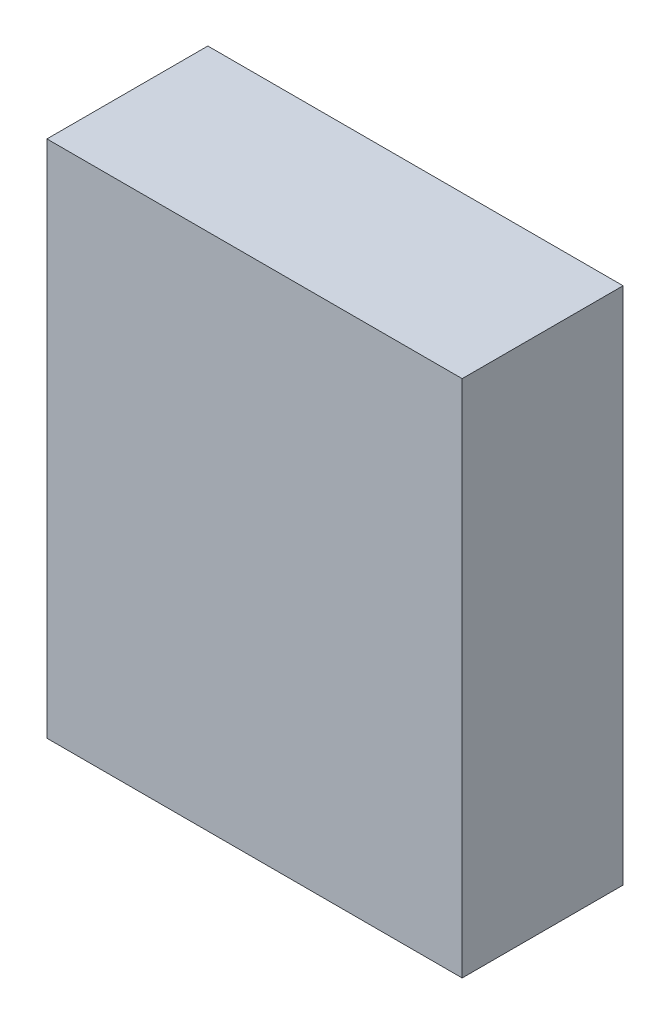
ISO-10303-21;
HEADER;
FILE_DESCRIPTION(('STEP AP214'),'2;1');
FILE_NAME('part.step','',(''),(''),'','','');
FILE_SCHEMA(('AUTOMOTIVE_DESIGN { 1 0 10303 214 1 1 1 1 }'));
ENDSEC;
DATA;
#1=APPLICATION_CONTEXT('core data for automotive mechanical design processes');
#2=APPLICATION_PROTOCOL_DEFINITION('international standard','automotive_design',2000,#1);
#3=PRODUCT_CONTEXT('',#1,'mechanical');
#4=PRODUCT('Part','Part','',(#3));
#5=PRODUCT_RELATED_PRODUCT_CATEGORY('part','',(#4));
#6=PRODUCT_DEFINITION_FORMATION('','',#4);
#7=PRODUCT_DEFINITION_CONTEXT('part definition',#1,'design');
#8=PRODUCT_DEFINITION('design','',#6,#7);
#9=PRODUCT_DEFINITION_SHAPE('','',#8);
#10=(LENGTH_UNIT() NAMED_UNIT(*) SI_UNIT(.MILLI.,.METRE.));
#11=(NAMED_UNIT(*) PLANE_ANGLE_UNIT() SI_UNIT($,.RADIAN.));
#12=(NAMED_UNIT(*) SI_UNIT($,.STERADIAN.) SOLID_ANGLE_UNIT());
#13=UNCERTAINTY_MEASURE_WITH_UNIT(LENGTH_MEASURE(1.E-05),#10,'distance_accuracy_value','');
#14=(GEOMETRIC_REPRESENTATION_CONTEXT(3) GLOBAL_UNCERTAINTY_ASSIGNED_CONTEXT((#13)) GLOBAL_UNIT_ASSIGNED_CONTEXT((#10,
#11,#12)) REPRESENTATION_CONTEXT('',''));
#15=CARTESIAN_POINT('',(0.,0.,0.));
#16=DIRECTION('',(0.,0.,1.));
#17=DIRECTION('',(1.,0.,0.));
#18=AXIS2_PLACEMENT_3D('',#15,#16,#17);
#19=CARTESIAN_POINT('',(-1.99999854,2.50000008,-1.54999944));
#20=DIRECTION('',(0.,0.,1.));
#21=DIRECTION('',(-1.,0.,0.));
#22=AXIS2_PLACEMENT_3D('',#19,#20,#21);
#23=PLANE('',#22);
#24=DIRECTION('',(1.,0.,0.));
#25=VECTOR('',#24,1.);
#26=CARTESIAN_POINT('',(-1.99999854,-2.50000008,-1.54999944));
#27=LINE('',#26,#25);
#28=CARTESIAN_POINT('',(-1.99999854,-2.50000008,-1.54999944));
#29=VERTEX_POINT('',#28);
#30=CARTESIAN_POINT('',(2.00000108,-2.50000008,-1.54999944));
#31=VERTEX_POINT('',#30);
#32=EDGE_CURVE('E86',#29,#31,#27,.T.);
#33=ORIENTED_EDGE('',*,*,#32,.F.);
#34=DIRECTION('',(0.,1.,0.));
#35=VECTOR('',#34,1.);
#36=CARTESIAN_POINT('',(-1.99999854,2.50000008,-1.54999944));
#37=LINE('',#36,#35);
#38=CARTESIAN_POINT('',(-1.99999854,2.50000008,-1.54999944));
#39=VERTEX_POINT('',#38);
#40=EDGE_CURVE('E94',#39,#29,#37,.F.);
#41=ORIENTED_EDGE('',*,*,#40,.F.);
#42=DIRECTION('',(1.,0.,0.));
#43=VECTOR('',#42,1.);
#44=CARTESIAN_POINT('',(2.00000108,2.50000008,-1.54999944));
#45=LINE('',#44,#43);
#46=CARTESIAN_POINT('',(2.00000108,2.50000008,-1.54999944));
#47=VERTEX_POINT('',#46);
#48=EDGE_CURVE('E40',#47,#39,#45,.F.);
#49=ORIENTED_EDGE('',*,*,#48,.F.);
#50=DIRECTION('',(0.,1.,0.));
#51=VECTOR('',#50,1.);
#52=CARTESIAN_POINT('',(2.00000108,-2.50000008,-1.54999944));
#53=LINE('',#52,#51);
#54=EDGE_CURVE('E87',#31,#47,#53,.T.);
#55=ORIENTED_EDGE('',*,*,#54,.F.);
#56=EDGE_LOOP('',(#33,#41,#49,#55));
#57=FACE_BOUND('',#56,.T.);
#58=ADVANCED_FACE('F37',(#57),#23,.F.);
#59=CARTESIAN_POINT('',(2.00000108,2.50000008,0.));
#60=DIRECTION('',(0.,-1.,0.));
#61=DIRECTION('',(0.,0.,1.));
#62=AXIS2_PLACEMENT_3D('',#59,#60,#61);
#63=PLANE('',#62);
#64=DIRECTION('',(0.,0.,1.));
#65=VECTOR('',#64,1.);
#66=CARTESIAN_POINT('',(-1.99999854,2.50000008,0.));
#67=LINE('',#66,#65);
#68=CARTESIAN_POINT('',(-1.99999854,2.50000008,0.));
#69=VERTEX_POINT('',#68);
#70=EDGE_CURVE('E97',#69,#39,#67,.F.);
#71=ORIENTED_EDGE('',*,*,#70,.F.);
#72=DIRECTION('',(-1.,0.,0.));
#73=VECTOR('',#72,1.);
#74=CARTESIAN_POINT('',(-1.99999854,2.50000008,0.));
#75=LINE('',#74,#73);
#76=CARTESIAN_POINT('',(2.00000108,2.50000008,0.));
#77=VERTEX_POINT('',#76);
#78=EDGE_CURVE('E85',#69,#77,#75,.F.);
#79=ORIENTED_EDGE('',*,*,#78,.T.);
#80=DIRECTION('',(0.,0.,-1.));
#81=VECTOR('',#80,1.);
#82=CARTESIAN_POINT('',(2.00000108,2.50000008,0.));
#83=LINE('',#82,#81);
#84=EDGE_CURVE('E80',#47,#77,#83,.F.);
#85=ORIENTED_EDGE('',*,*,#84,.F.);
#86=ORIENTED_EDGE('',*,*,#48,.T.);
#87=EDGE_LOOP('',(#71,#79,#85,#86));
#88=FACE_BOUND('',#87,.T.);
#89=ADVANCED_FACE('F82',(#88),#63,.F.);
#90=CARTESIAN_POINT('',(2.00000108,-2.50000008,0.));
#91=DIRECTION('',(-1.,0.,0.));
#92=DIRECTION('',(0.,0.,-1.));
#93=AXIS2_PLACEMENT_3D('',#90,#91,#92);
#94=PLANE('',#93);
#95=ORIENTED_EDGE('',*,*,#84,.T.);
#96=DIRECTION('',(0.,1.,0.));
#97=VECTOR('',#96,1.);
#98=CARTESIAN_POINT('',(2.00000108,2.50000008,0.));
#99=LINE('',#98,#97);
#100=CARTESIAN_POINT('',(2.00000108,-2.50000008,0.));
#101=VERTEX_POINT('',#100);
#102=EDGE_CURVE('E109',#77,#101,#99,.F.);
#103=ORIENTED_EDGE('',*,*,#102,.T.);
#104=DIRECTION('',(0.,0.,-1.));
#105=VECTOR('',#104,1.);
#106=CARTESIAN_POINT('',(2.00000108,-2.50000008,0.));
#107=LINE('',#106,#105);
#108=EDGE_CURVE('E73',#31,#101,#107,.F.);
#109=ORIENTED_EDGE('',*,*,#108,.F.);
#110=ORIENTED_EDGE('',*,*,#54,.T.);
#111=EDGE_LOOP('',(#95,#103,#109,#110));
#112=FACE_BOUND('',#111,.T.);
#113=ADVANCED_FACE('F89',(#112),#94,.F.);
#114=CARTESIAN_POINT('',(-1.99999854,-2.50000008,0.));
#115=DIRECTION('',(0.,1.,0.));
#116=DIRECTION('',(0.,0.,-1.));
#117=AXIS2_PLACEMENT_3D('',#114,#115,#116);
#118=PLANE('',#117);
#119=ORIENTED_EDGE('',*,*,#108,.T.);
#120=DIRECTION('',(-1.,0.,0.));
#121=VECTOR('',#120,1.);
#122=CARTESIAN_POINT('',(-1.99999854,-2.50000008,0.));
#123=LINE('',#122,#121);
#124=CARTESIAN_POINT('',(-1.99999854,-2.50000008,0.));
#125=VERTEX_POINT('',#124);
#126=EDGE_CURVE('E46',#101,#125,#123,.T.);
#127=ORIENTED_EDGE('',*,*,#126,.T.);
#128=DIRECTION('',(0.,0.,1.));
#129=VECTOR('',#128,1.);
#130=CARTESIAN_POINT('',(-1.99999854,-2.50000008,0.));
#131=LINE('',#130,#129);
#132=EDGE_CURVE('E96',#29,#125,#131,.T.);
#133=ORIENTED_EDGE('',*,*,#132,.F.);
#134=ORIENTED_EDGE('',*,*,#32,.T.);
#135=EDGE_LOOP('',(#119,#127,#133,#134));
#136=FACE_BOUND('',#135,.T.);
#137=ADVANCED_FACE('F105',(#136),#118,.F.);
#138=CARTESIAN_POINT('',(-1.99999854,2.50000008,0.));
#139=DIRECTION('',(1.,0.,0.));
#140=DIRECTION('',(0.,0.,1.));
#141=AXIS2_PLACEMENT_3D('',#138,#139,#140);
#142=PLANE('',#141);
#143=ORIENTED_EDGE('',*,*,#132,.T.);
#144=DIRECTION('',(0.,1.,0.));
#145=VECTOR('',#144,1.);
#146=CARTESIAN_POINT('',(-1.99999854,2.50000008,0.));
#147=LINE('',#146,#145);
#148=EDGE_CURVE('E11',#125,#69,#147,.T.);
#149=ORIENTED_EDGE('',*,*,#148,.T.);
#150=ORIENTED_EDGE('',*,*,#70,.T.);
#151=ORIENTED_EDGE('',*,*,#40,.T.);
#152=EDGE_LOOP('',(#143,#149,#150,#151));
#153=FACE_BOUND('',#152,.T.);
#154=ADVANCED_FACE('F107',(#153),#142,.F.);
#155=CARTESIAN_POINT('',(-1.99999854,2.50000008,0.));
#156=DIRECTION('',(0.,0.,1.));
#157=DIRECTION('',(-1.,0.,0.));
#158=AXIS2_PLACEMENT_3D('',#155,#156,#157);
#159=PLANE('',#158);
#160=ORIENTED_EDGE('',*,*,#126,.F.);
#161=ORIENTED_EDGE('',*,*,#102,.F.);
#162=ORIENTED_EDGE('',*,*,#78,.F.);
#163=ORIENTED_EDGE('',*,*,#148,.F.);
#164=EDGE_LOOP('',(#160,#161,#162,#163));
#165=FACE_BOUND('',#164,.T.);
#166=ADVANCED_FACE('F108',(#165),#159,.T.);
#167=CLOSED_SHELL('',(#58,#89,#113,#137,#154,#166));
#168=MANIFOLD_SOLID_BREP('B2',#167);
#169=ADVANCED_BREP_SHAPE_REPRESENTATION('',(#18,#168),#14);
#170=SHAPE_DEFINITION_REPRESENTATION(#9,#169);
ENDSEC;
END-ISO-10303-21;
